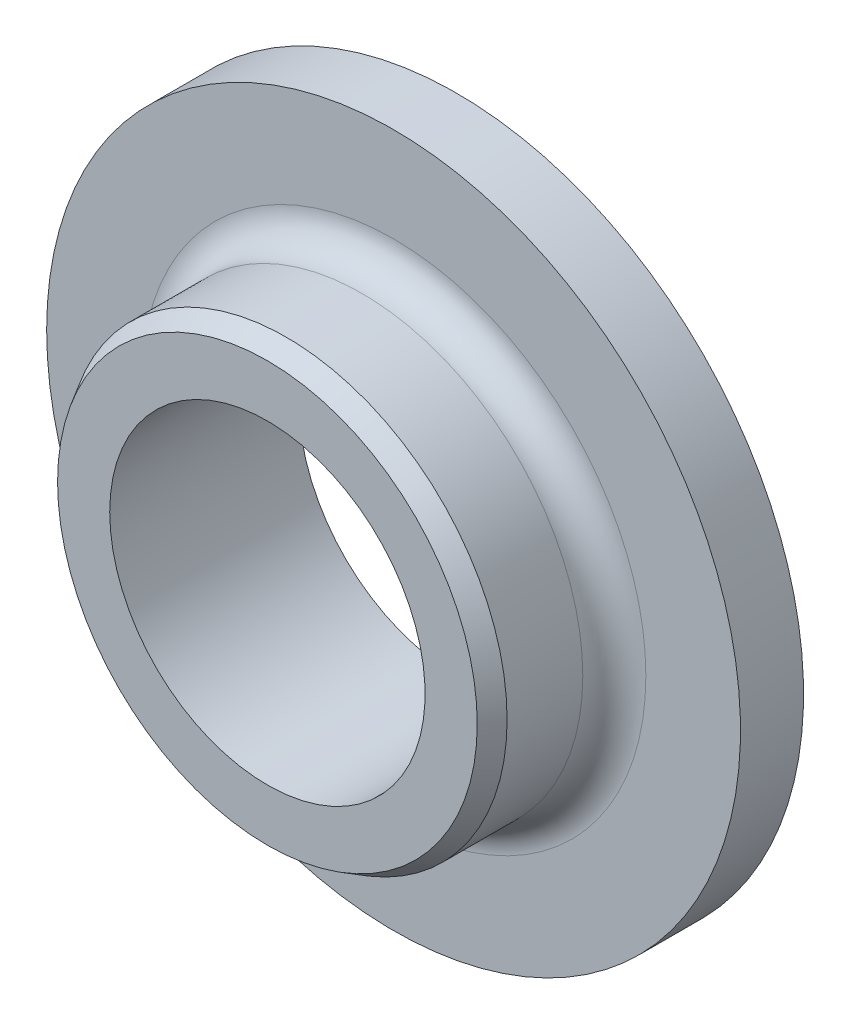
ISO-10303-21;
HEADER;
FILE_DESCRIPTION(('STEP AP214'),'2;1');
FILE_NAME('part.step','',(''),(''),'','','');
FILE_SCHEMA(('AUTOMOTIVE_DESIGN { 1 0 10303 214 1 1 1 1 }'));
ENDSEC;
DATA;
#1=APPLICATION_CONTEXT('core data for automotive mechanical design processes');
#2=APPLICATION_PROTOCOL_DEFINITION('international standard','automotive_design',2000,#1);
#3=PRODUCT_CONTEXT('',#1,'mechanical');
#4=PRODUCT('Part','Part','',(#3));
#5=PRODUCT_RELATED_PRODUCT_CATEGORY('part','',(#4));
#6=PRODUCT_DEFINITION_FORMATION('','',#4);
#7=PRODUCT_DEFINITION_CONTEXT('part definition',#1,'design');
#8=PRODUCT_DEFINITION('design','',#6,#7);
#9=PRODUCT_DEFINITION_SHAPE('','',#8);
#10=(LENGTH_UNIT() NAMED_UNIT(*) SI_UNIT(.MILLI.,.METRE.));
#11=(NAMED_UNIT(*) PLANE_ANGLE_UNIT() SI_UNIT($,.RADIAN.));
#12=(NAMED_UNIT(*) SI_UNIT($,.STERADIAN.) SOLID_ANGLE_UNIT());
#13=UNCERTAINTY_MEASURE_WITH_UNIT(LENGTH_MEASURE(1.E-05),#10,'distance_accuracy_value','');
#14=(GEOMETRIC_REPRESENTATION_CONTEXT(3) GLOBAL_UNCERTAINTY_ASSIGNED_CONTEXT((#13)) GLOBAL_UNIT_ASSIGNED_CONTEXT((#10,
#11,#12)) REPRESENTATION_CONTEXT('',''));
#15=CARTESIAN_POINT('',(0.,0.,0.));
#16=DIRECTION('',(0.,0.,1.));
#17=DIRECTION('',(1.,0.,0.));
#18=AXIS2_PLACEMENT_3D('',#15,#16,#17);
#19=CARTESIAN_POINT('',(0.,0.,2.1));
#20=DIRECTION('',(0.,0.,-1.));
#21=DIRECTION('',(-1.,0.,0.));
#22=AXIS2_PLACEMENT_3D('',#19,#20,#21);
#23=CYLINDRICAL_SURFACE('',#22,3.5);
#24=CARTESIAN_POINT('',(0.,0.,2.70000000000437));
#25=DIRECTION('',(0.,0.,-1.));
#26=DIRECTION('',(1.,0.,0.));
#27=AXIS2_PLACEMENT_3D('',#24,#25,#26);
#28=CIRCLE('',#27,3.49999999997408);
#29=CARTESIAN_POINT('',(3.49999999997408,0.,2.70000000000437));
#30=VERTEX_POINT('',#29);
#31=EDGE_CURVE('E41',#30,#30,#28,.F.);
#32=ORIENTED_EDGE('',*,*,#31,.F.);
#33=EDGE_LOOP('',(#32));
#34=FACE_BOUND('',#33,.T.);
#35=CARTESIAN_POINT('',(0.,0.,1.5));
#36=DIRECTION('',(0.,0.,1.));
#37=DIRECTION('',(1.,0.,0.));
#38=AXIS2_PLACEMENT_3D('',#35,#36,#37);
#39=CIRCLE('',#38,3.5);
#40=CARTESIAN_POINT('',(3.5,0.,1.5));
#41=VERTEX_POINT('',#40);
#42=EDGE_CURVE('E85',#41,#41,#39,.T.);
#43=ORIENTED_EDGE('',*,*,#42,.T.);
#44=EDGE_LOOP('',(#43));
#45=FACE_BOUND('',#44,.T.);
#46=ADVANCED_FACE('F17',(#34,#45),#23,.T.);
#47=CARTESIAN_POINT('',(0.,0.,1.5));
#48=DIRECTION('',(0.,0.,1.));
#49=DIRECTION('',(1.,0.,0.));
#50=AXIS2_PLACEMENT_3D('',#47,#48,#49);
#51=TOROIDAL_SURFACE('',#50,4.,0.500000000000001);
#52=CARTESIAN_POINT('',(0.,0.,0.999999999999999));
#53=DIRECTION('',(0.,0.,1.));
#54=DIRECTION('',(-1.,0.,0.));
#55=AXIS2_PLACEMENT_3D('',#52,#53,#54);
#56=CIRCLE('',#55,4.);
#57=CARTESIAN_POINT('',(4.,0.,1.));
#58=VERTEX_POINT('',#57);
#59=CARTESIAN_POINT('',(-4.,0.,1.));
#60=VERTEX_POINT('',#59);
#61=EDGE_CURVE('E33',#58,#60,#56,.F.);
#62=ORIENTED_EDGE('',*,*,#61,.F.);
#63=CARTESIAN_POINT('',(0.,0.,0.999999999999999));
#64=DIRECTION('',(0.,0.,1.));
#65=DIRECTION('',(1.,0.,0.));
#66=AXIS2_PLACEMENT_3D('',#63,#64,#65);
#67=CIRCLE('',#66,4.);
#68=EDGE_CURVE('E36',#60,#58,#67,.F.);
#69=ORIENTED_EDGE('',*,*,#68,.F.);
#70=EDGE_LOOP('',(#62,#69));
#71=FACE_BOUND('',#70,.T.);
#72=ORIENTED_EDGE('',*,*,#42,.F.);
#73=EDGE_LOOP('',(#72));
#74=FACE_BOUND('',#73,.T.);
#75=ADVANCED_FACE('F37',(#71,#74),#51,.F.);
#76=CARTESIAN_POINT('',(0.,0.,2.70000000000437));
#77=DIRECTION('',(0.,0.,-1.));
#78=DIRECTION('',(-1.,0.,0.));
#79=AXIS2_PLACEMENT_3D('',#76,#77,#78);
#80=CONICAL_SURFACE('',#79,3.49999999997408,0.523598775634054);
#81=CARTESIAN_POINT('',(0.,0.,2.99999999992906));
#82=DIRECTION('',(0.,0.,-1.));
#83=DIRECTION('',(-1.,0.,0.));
#84=AXIS2_PLACEMENT_3D('',#81,#82,#83);
#85=CIRCLE('',#84,3.32679491924637);
#86=CARTESIAN_POINT('',(-3.32679491924637,0.,2.99999999992906));
#87=VERTEX_POINT('',#86);
#88=EDGE_CURVE('E45',#87,#87,#85,.F.);
#89=ORIENTED_EDGE('',*,*,#88,.F.);
#90=EDGE_LOOP('',(#89));
#91=FACE_BOUND('',#90,.T.);
#92=ORIENTED_EDGE('',*,*,#31,.T.);
#93=EDGE_LOOP('',(#92));
#94=FACE_BOUND('',#93,.T.);
#95=ADVANCED_FACE('F65',(#91,#94),#80,.T.);
#96=CARTESIAN_POINT('',(4.75,0.,1.));
#97=DIRECTION('',(0.,0.,1.));
#98=DIRECTION('',(1.,0.,0.));
#99=AXIS2_PLACEMENT_3D('',#96,#97,#98);
#100=PLANE('',#99);
#101=CARTESIAN_POINT('',(0.,0.,1.));
#102=DIRECTION('',(0.,0.,-1.));
#103=DIRECTION('',(-1.,0.,0.));
#104=AXIS2_PLACEMENT_3D('',#101,#102,#103);
#105=CIRCLE('',#104,5.5);
#106=CARTESIAN_POINT('',(-5.5,0.,1.));
#107=VERTEX_POINT('',#106);
#108=EDGE_CURVE('E93',#107,#107,#105,.T.);
#109=ORIENTED_EDGE('',*,*,#108,.F.);
#110=EDGE_LOOP('',(#109));
#111=FACE_BOUND('',#110,.T.);
#112=ORIENTED_EDGE('',*,*,#68,.T.);
#113=ORIENTED_EDGE('',*,*,#61,.T.);
#114=EDGE_LOOP('',(#112,#113));
#115=FACE_BOUND('',#114,.T.);
#116=ADVANCED_FACE('F44',(#111,#115),#100,.T.);
#117=CARTESIAN_POINT('',(2.91339745962156,0.,3.));
#118=DIRECTION('',(0.,0.,1.));
#119=DIRECTION('',(1.,0.,0.));
#120=AXIS2_PLACEMENT_3D('',#117,#118,#119);
#121=PLANE('',#120);
#122=ORIENTED_EDGE('',*,*,#88,.T.);
#123=EDGE_LOOP('',(#122));
#124=FACE_BOUND('',#123,.T.);
#125=CARTESIAN_POINT('',(0.,0.,3.));
#126=DIRECTION('',(0.,0.,-1.));
#127=DIRECTION('',(-1.,0.,0.));
#128=AXIS2_PLACEMENT_3D('',#125,#126,#127);
#129=CIRCLE('',#128,2.5);
#130=CARTESIAN_POINT('',(-2.5,0.,3.));
#131=VERTEX_POINT('',#130);
#132=EDGE_CURVE('E90',#131,#131,#129,.T.);
#133=ORIENTED_EDGE('',*,*,#132,.T.);
#134=EDGE_LOOP('',(#133));
#135=FACE_BOUND('',#134,.T.);
#136=ADVANCED_FACE('F64',(#124,#135),#121,.T.);
#137=CARTESIAN_POINT('',(0.,0.,0.5));
#138=DIRECTION('',(0.,0.,-1.));
#139=DIRECTION('',(-1.,0.,0.));
#140=AXIS2_PLACEMENT_3D('',#137,#138,#139);
#141=CYLINDRICAL_SURFACE('',#140,5.5);
#142=ORIENTED_EDGE('',*,*,#108,.T.);
#143=EDGE_LOOP('',(#142));
#144=FACE_BOUND('',#143,.T.);
#145=CARTESIAN_POINT('',(0.,0.,0.));
#146=DIRECTION('',(0.,0.,-1.));
#147=DIRECTION('',(-1.,0.,0.));
#148=AXIS2_PLACEMENT_3D('',#145,#146,#147);
#149=CIRCLE('',#148,5.5);
#150=CARTESIAN_POINT('',(-5.5,0.,0.));
#151=VERTEX_POINT('',#150);
#152=EDGE_CURVE('E26',#151,#151,#149,.T.);
#153=ORIENTED_EDGE('',*,*,#152,.F.);
#154=EDGE_LOOP('',(#153));
#155=FACE_BOUND('',#154,.T.);
#156=ADVANCED_FACE('F116',(#144,#155),#141,.T.);
#157=CARTESIAN_POINT('',(0.,0.,1.5));
#158=DIRECTION('',(0.,0.,-1.));
#159=DIRECTION('',(-1.,0.,0.));
#160=AXIS2_PLACEMENT_3D('',#157,#158,#159);
#161=CYLINDRICAL_SURFACE('',#160,2.5);
#162=CARTESIAN_POINT('',(0.,0.,0.));
#163=DIRECTION('',(0.,0.,-1.));
#164=DIRECTION('',(-1.,0.,0.));
#165=AXIS2_PLACEMENT_3D('',#162,#163,#164);
#166=CIRCLE('',#165,2.5);
#167=CARTESIAN_POINT('',(-2.5,0.,0.));
#168=VERTEX_POINT('',#167);
#169=EDGE_CURVE('E11',#168,#168,#166,.F.);
#170=ORIENTED_EDGE('',*,*,#169,.F.);
#171=EDGE_LOOP('',(#170));
#172=FACE_BOUND('',#171,.T.);
#173=ORIENTED_EDGE('',*,*,#132,.F.);
#174=EDGE_LOOP('',(#173));
#175=FACE_BOUND('',#174,.T.);
#176=ADVANCED_FACE('F110',(#172,#175),#161,.F.);
#177=CARTESIAN_POINT('',(4.,0.,0.));
#178=DIRECTION('',(0.,0.,-1.));
#179=DIRECTION('',(-1.,0.,0.));
#180=AXIS2_PLACEMENT_3D('',#177,#178,#179);
#181=PLANE('',#180);
#182=ORIENTED_EDGE('',*,*,#169,.T.);
#183=EDGE_LOOP('',(#182));
#184=FACE_BOUND('',#183,.T.);
#185=ORIENTED_EDGE('',*,*,#152,.T.);
#186=EDGE_LOOP('',(#185));
#187=FACE_BOUND('',#186,.T.);
#188=ADVANCED_FACE('F108',(#184,#187),#181,.T.);
#189=CLOSED_SHELL('',(#46,#75,#95,#116,#136,#156,#176,#188));
#190=MANIFOLD_SOLID_BREP('B1',#189);
#191=ADVANCED_BREP_SHAPE_REPRESENTATION('',(#18,#190),#14);
#192=SHAPE_DEFINITION_REPRESENTATION(#9,#191);
ENDSEC;
END-ISO-10303-21;
